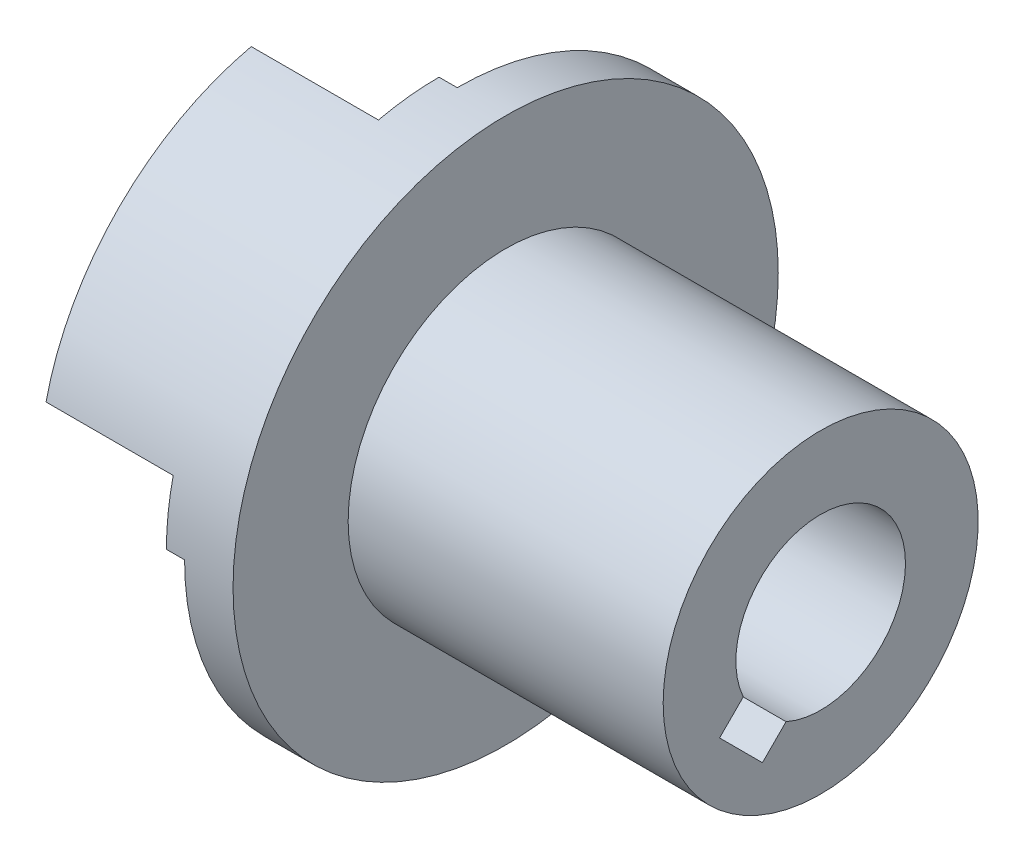
ISO-10303-21;
HEADER;
FILE_DESCRIPTION(('STEP AP214'),'2;1');
FILE_NAME('part.step','',(''),(''),'','','');
FILE_SCHEMA(('AUTOMOTIVE_DESIGN { 1 0 10303 214 1 1 1 1 }'));
ENDSEC;
DATA;
#1=APPLICATION_CONTEXT('core data for automotive mechanical design processes');
#2=APPLICATION_PROTOCOL_DEFINITION('international standard','automotive_design',2000,#1);
#3=PRODUCT_CONTEXT('',#1,'mechanical');
#4=PRODUCT('Part','Part','',(#3));
#5=PRODUCT_RELATED_PRODUCT_CATEGORY('part','',(#4));
#6=PRODUCT_DEFINITION_FORMATION('','',#4);
#7=PRODUCT_DEFINITION_CONTEXT('part definition',#1,'design');
#8=PRODUCT_DEFINITION('design','',#6,#7);
#9=PRODUCT_DEFINITION_SHAPE('','',#8);
#10=(LENGTH_UNIT() NAMED_UNIT(*) SI_UNIT(.MILLI.,.METRE.));
#11=(NAMED_UNIT(*) PLANE_ANGLE_UNIT() SI_UNIT($,.RADIAN.));
#12=(NAMED_UNIT(*) SI_UNIT($,.STERADIAN.) SOLID_ANGLE_UNIT());
#13=UNCERTAINTY_MEASURE_WITH_UNIT(LENGTH_MEASURE(1.E-05),#10,'distance_accuracy_value','');
#14=(GEOMETRIC_REPRESENTATION_CONTEXT(3) GLOBAL_UNCERTAINTY_ASSIGNED_CONTEXT((#13)) GLOBAL_UNIT_ASSIGNED_CONTEXT((#10,
#11,#12)) REPRESENTATION_CONTEXT('',''));
#15=CARTESIAN_POINT('',(0.,0.,0.));
#16=DIRECTION('',(0.,0.,1.));
#17=DIRECTION('',(1.,0.,0.));
#18=AXIS2_PLACEMENT_3D('',#15,#16,#17);
#19=CARTESIAN_POINT('',(-1.5,0.,0.));
#20=DIRECTION('',(-1.,0.,0.));
#21=DIRECTION('',(0.,0.,-1.));
#22=AXIS2_PLACEMENT_3D('',#19,#20,#21);
#23=PLANE('',#22);
#24=DIRECTION('',(0.,0.707106781186544,-0.707106781186552));
#25=VECTOR('',#24,1.);
#26=CARTESIAN_POINT('',(-1.5,-14.1421356237309,0.));
#27=LINE('',#26,#25);
#28=CARTESIAN_POINT('',(-1.5,-14.1421356237309,0.));
#29=VERTEX_POINT('',#28);
#30=CARTESIAN_POINT('',(-1.5,-9.14213562373095,-5.));
#31=VERTEX_POINT('',#30);
#32=EDGE_CURVE('E234',#29,#31,#27,.T.);
#33=ORIENTED_EDGE('',*,*,#32,.T.);
#34=DIRECTION('',(0.,1.,0.));
#35=VECTOR('',#34,1.);
#36=CARTESIAN_POINT('',(-1.5,-21.9374109684803,-5.));
#37=LINE('',#36,#35);
#38=CARTESIAN_POINT('',(-1.5,-21.9374109684803,-5.));
#39=VERTEX_POINT('',#38);
#40=EDGE_CURVE('E204',#39,#31,#37,.T.);
#41=ORIENTED_EDGE('',*,*,#40,.F.);
#42=CARTESIAN_POINT('',(-1.5,0.,0.));
#43=DIRECTION('',(-1.,0.,0.));
#44=DIRECTION('',(0.,0.,-1.));
#45=AXIS2_PLACEMENT_3D('',#42,#43,#44);
#46=CIRCLE('',#45,22.5);
#47=CARTESIAN_POINT('',(-1.5,-22.5,0.));
#48=VERTEX_POINT('',#47);
#49=EDGE_CURVE('E231',#39,#48,#46,.T.);
#50=ORIENTED_EDGE('',*,*,#49,.T.);
#51=DIRECTION('',(0.,1.,0.));
#52=VECTOR('',#51,1.);
#53=CARTESIAN_POINT('',(-1.5,-22.5,0.));
#54=LINE('',#53,#52);
#55=EDGE_CURVE('E230',#48,#29,#54,.T.);
#56=ORIENTED_EDGE('',*,*,#55,.T.);
#57=EDGE_LOOP('',(#33,#41,#50,#56));
#58=FACE_BOUND('',#57,.T.);
#59=ADVANCED_FACE('F35',(#58),#23,.T.);
#60=CARTESIAN_POINT('',(-1.5,0.,-22.5));
#61=VERTEX_POINT('',#60);
#62=CARTESIAN_POINT('',(-1.5,-5.,-21.9374109684803));
#63=VERTEX_POINT('',#62);
#64=EDGE_CURVE('E227',#61,#63,#46,.T.);
#65=ORIENTED_EDGE('',*,*,#64,.T.);
#66=DIRECTION('',(0.,0.,-1.));
#67=VECTOR('',#66,1.);
#68=CARTESIAN_POINT('',(-1.5,-5.,-9.14213562373095));
#69=LINE('',#68,#67);
#70=CARTESIAN_POINT('',(-1.5,-5.,-9.14213562373098));
#71=VERTEX_POINT('',#70);
#72=EDGE_CURVE('E209',#71,#63,#69,.T.);
#73=ORIENTED_EDGE('',*,*,#72,.F.);
#74=CARTESIAN_POINT('',(-1.5,0.,-14.142135623731));
#75=VERTEX_POINT('',#74);
#76=EDGE_CURVE('E233',#71,#75,#27,.T.);
#77=ORIENTED_EDGE('',*,*,#76,.T.);
#78=DIRECTION('',(0.,0.,-1.));
#79=VECTOR('',#78,1.);
#80=CARTESIAN_POINT('',(-1.5,0.,-22.5));
#81=LINE('',#80,#79);
#82=EDGE_CURVE('E237',#75,#61,#81,.T.);
#83=ORIENTED_EDGE('',*,*,#82,.T.);
#84=EDGE_LOOP('',(#65,#73,#77,#83));
#85=FACE_BOUND('',#84,.T.);
#86=ADVANCED_FACE('F391',(#85),#23,.T.);
#87=CARTESIAN_POINT('',(0.,22.5,0.));
#88=DIRECTION('',(1.,0.,0.));
#89=DIRECTION('',(0.,0.,-1.));
#90=AXIS2_PLACEMENT_3D('',#87,#88,#89);
#91=PLANE('',#90);
#92=DIRECTION('',(0.,-0.707106781186547,-0.707106781186548));
#93=VECTOR('',#92,1.);
#94=CARTESIAN_POINT('',(0.,4.67390693496511,17.8260930650349));
#95=LINE('',#94,#93);
#96=CARTESIAN_POINT('',(0.,-4.80832611206852,8.34386001800126));
#97=VERTEX_POINT('',#96);
#98=CARTESIAN_POINT('',(0.,-8.34386001800126,4.80832611206852));
#99=VERTEX_POINT('',#98);
#100=EDGE_CURVE('E180',#97,#99,#95,.T.);
#101=ORIENTED_EDGE('',*,*,#100,.T.);
#102=DIRECTION('',(0.,0.707106781186548,-0.707106781186547));
#103=VECTOR('',#102,1.);
#104=CARTESIAN_POINT('',(0.,9.48223304703364,-13.0177669529664));
#105=LINE('',#104,#103);
#106=CARTESIAN_POINT('',(0.,-6.3910774551931,2.85554354926036));
#107=VERTEX_POINT('',#106);
#108=EDGE_CURVE('E201',#99,#107,#105,.T.);
#109=ORIENTED_EDGE('',*,*,#108,.T.);
#110=CARTESIAN_POINT('',(0.,0.,0.));
#111=DIRECTION('',(-1.,0.,0.));
#112=DIRECTION('',(0.,0.,1.));
#113=AXIS2_PLACEMENT_3D('',#110,#111,#112);
#114=CIRCLE('',#113,7.);
#115=CARTESIAN_POINT('',(0.,-2.85554354926037,6.3910774551931));
#116=VERTEX_POINT('',#115);
#117=EDGE_CURVE('E328',#116,#107,#114,.T.);
#118=ORIENTED_EDGE('',*,*,#117,.F.);
#119=DIRECTION('',(0.,-0.707106781186547,0.707106781186548));
#120=VECTOR('',#119,1.);
#121=CARTESIAN_POINT('',(0.,13.0177669529664,-9.48223304703363));
#122=LINE('',#121,#120);
#123=EDGE_CURVE('E195',#116,#97,#122,.T.);
#124=ORIENTED_EDGE('',*,*,#123,.T.);
#125=EDGE_LOOP('',(#101,#109,#118,#124));
#126=FACE_BOUND('',#125,.T.);
#127=DIRECTION('',(0.,1.,0.));
#128=VECTOR('',#127,1.);
#129=CARTESIAN_POINT('',(0.,-22.5,0.));
#130=LINE('',#129,#128);
#131=CARTESIAN_POINT('',(0.,-22.5,0.));
#132=VERTEX_POINT('',#131);
#133=CARTESIAN_POINT('',(0.,-14.1421356237309,0.));
#134=VERTEX_POINT('',#133);
#135=EDGE_CURVE('E226',#132,#134,#130,.T.);
#136=ORIENTED_EDGE('',*,*,#135,.F.);
#137=CARTESIAN_POINT('',(0.,0.,0.));
#138=DIRECTION('',(-1.,0.,0.));
#139=DIRECTION('',(0.,0.,1.));
#140=AXIS2_PLACEMENT_3D('',#137,#138,#139);
#141=CIRCLE('',#140,22.5);
#142=CARTESIAN_POINT('',(0.,0.,22.5));
#143=VERTEX_POINT('',#142);
#144=EDGE_CURVE('E330',#132,#143,#141,.T.);
#145=ORIENTED_EDGE('',*,*,#144,.T.);
#146=DIRECTION('',(0.,0.,1.));
#147=VECTOR('',#146,1.);
#148=CARTESIAN_POINT('',(0.,0.,22.5));
#149=LINE('',#148,#147);
#150=CARTESIAN_POINT('',(0.,0.,14.142135623731));
#151=VERTEX_POINT('',#150);
#152=EDGE_CURVE('E303',#151,#143,#149,.T.);
#153=ORIENTED_EDGE('',*,*,#152,.F.);
#154=DIRECTION('',(0.,-0.707106781186544,0.707106781186552));
#155=VECTOR('',#154,1.);
#156=CARTESIAN_POINT('',(0.,14.1421356237309,0.));
#157=LINE('',#156,#155);
#158=CARTESIAN_POINT('',(0.,14.1421356237309,0.));
#159=VERTEX_POINT('',#158);
#160=EDGE_CURVE('E300',#159,#151,#157,.T.);
#161=ORIENTED_EDGE('',*,*,#160,.F.);
#162=DIRECTION('',(0.,-1.,0.));
#163=VECTOR('',#162,1.);
#164=CARTESIAN_POINT('',(0.,22.5,0.));
#165=LINE('',#164,#163);
#166=CARTESIAN_POINT('',(0.,22.5,0.));
#167=VERTEX_POINT('',#166);
#168=EDGE_CURVE('E286',#167,#159,#165,.T.);
#169=ORIENTED_EDGE('',*,*,#168,.F.);
#170=CARTESIAN_POINT('',(0.,0.,-22.5));
#171=VERTEX_POINT('',#170);
#172=EDGE_CURVE('E43',#167,#171,#141,.T.);
#173=ORIENTED_EDGE('',*,*,#172,.T.);
#174=DIRECTION('',(0.,0.,-1.));
#175=VECTOR('',#174,1.);
#176=CARTESIAN_POINT('',(0.,0.,-22.5));
#177=LINE('',#176,#175);
#178=CARTESIAN_POINT('',(0.,0.,-14.142135623731));
#179=VERTEX_POINT('',#178);
#180=EDGE_CURVE('E245',#179,#171,#177,.T.);
#181=ORIENTED_EDGE('',*,*,#180,.F.);
#182=DIRECTION('',(0.,0.707106781186544,-0.707106781186552));
#183=VECTOR('',#182,1.);
#184=CARTESIAN_POINT('',(0.,-14.1421356237309,0.));
#185=LINE('',#184,#183);
#186=EDGE_CURVE('E242',#134,#179,#185,.T.);
#187=ORIENTED_EDGE('',*,*,#186,.F.);
#188=EDGE_LOOP('',(#136,#145,#153,#161,#169,#173,#181,#187));
#189=FACE_BOUND('',#188,.T.);
#190=ADVANCED_FACE('F334',(#126,#189),#91,.F.);
#191=CARTESIAN_POINT('',(-1.5,0.,0.));
#192=DIRECTION('',(-1.,0.,0.));
#193=DIRECTION('',(0.,0.,1.));
#194=AXIS2_PLACEMENT_3D('',#191,#192,#193);
#195=PLANE('',#194);
#196=DIRECTION('',(0.,0.,1.));
#197=VECTOR('',#196,1.);
#198=CARTESIAN_POINT('',(-1.5,5.,9.14213562373095));
#199=LINE('',#198,#197);
#200=CARTESIAN_POINT('',(-1.5,5.,9.14213562373098));
#201=VERTEX_POINT('',#200);
#202=CARTESIAN_POINT('',(-1.5,5.,21.9374109684803));
#203=VERTEX_POINT('',#202);
#204=EDGE_CURVE('E264',#201,#203,#199,.T.);
#205=ORIENTED_EDGE('',*,*,#204,.F.);
#206=DIRECTION('',(0.,-0.707106781186544,0.707106781186552));
#207=VECTOR('',#206,1.);
#208=CARTESIAN_POINT('',(-1.5,14.1421356237309,0.));
#209=LINE('',#208,#207);
#210=CARTESIAN_POINT('',(-1.5,0.,14.142135623731));
#211=VERTEX_POINT('',#210);
#212=EDGE_CURVE('E292',#201,#211,#209,.T.);
#213=ORIENTED_EDGE('',*,*,#212,.T.);
#214=DIRECTION('',(0.,0.,1.));
#215=VECTOR('',#214,1.);
#216=CARTESIAN_POINT('',(-1.5,0.,22.5));
#217=LINE('',#216,#215);
#218=CARTESIAN_POINT('',(-1.5,0.,22.5));
#219=VERTEX_POINT('',#218);
#220=EDGE_CURVE('E295',#211,#219,#217,.T.);
#221=ORIENTED_EDGE('',*,*,#220,.T.);
#222=CARTESIAN_POINT('',(-1.5,0.,0.));
#223=DIRECTION('',(-1.,0.,0.));
#224=DIRECTION('',(0.,0.,1.));
#225=AXIS2_PLACEMENT_3D('',#222,#223,#224);
#226=CIRCLE('',#225,22.5);
#227=EDGE_CURVE('E287',#219,#203,#226,.T.);
#228=ORIENTED_EDGE('',*,*,#227,.T.);
#229=EDGE_LOOP('',(#205,#213,#221,#228));
#230=FACE_BOUND('',#229,.T.);
#231=ADVANCED_FACE('F347',(#230),#195,.T.);
#232=CARTESIAN_POINT('',(0.,0.,0.));
#233=DIRECTION('',(-1.,0.,0.));
#234=DIRECTION('',(0.,0.,1.));
#235=AXIS2_PLACEMENT_3D('',#232,#233,#234);
#236=CYLINDRICAL_SURFACE('',#235,22.5);
#237=ORIENTED_EDGE('',*,*,#172,.F.);
#238=DIRECTION('',(1.,0.,0.));
#239=VECTOR('',#238,1.);
#240=CARTESIAN_POINT('',(-1.5,22.5,0.));
#241=LINE('',#240,#239);
#242=CARTESIAN_POINT('',(-1.5,22.5,0.));
#243=VERTEX_POINT('',#242);
#244=EDGE_CURVE('E314',#243,#167,#241,.T.);
#245=ORIENTED_EDGE('',*,*,#244,.F.);
#246=CARTESIAN_POINT('',(-1.5,21.9374109684803,5.));
#247=VERTEX_POINT('',#246);
#248=EDGE_CURVE('E290',#247,#243,#226,.T.);
#249=ORIENTED_EDGE('',*,*,#248,.F.);
#250=DIRECTION('',(1.,0.,0.));
#251=VECTOR('',#250,1.);
#252=CARTESIAN_POINT('',(-12.,21.9374109684803,5.));
#253=LINE('',#252,#251);
#254=CARTESIAN_POINT('',(-12.,21.9374109684803,5.));
#255=VERTEX_POINT('',#254);
#256=EDGE_CURVE('E283',#255,#247,#253,.T.);
#257=ORIENTED_EDGE('',*,*,#256,.F.);
#258=CARTESIAN_POINT('',(-12.,0.,0.));
#259=DIRECTION('',(-1.,0.,0.));
#260=DIRECTION('',(0.,0.,1.));
#261=AXIS2_PLACEMENT_3D('',#258,#259,#260);
#262=CIRCLE('',#261,22.5);
#263=CARTESIAN_POINT('',(-12.,5.,21.9374109684803));
#264=VERTEX_POINT('',#263);
#265=EDGE_CURVE('E260',#264,#255,#262,.T.);
#266=ORIENTED_EDGE('',*,*,#265,.F.);
#267=DIRECTION('',(1.,0.,0.));
#268=VECTOR('',#267,1.);
#269=CARTESIAN_POINT('',(-12.,5.,21.9374109684803));
#270=LINE('',#269,#268);
#271=EDGE_CURVE('E270',#264,#203,#270,.T.);
#272=ORIENTED_EDGE('',*,*,#271,.T.);
#273=ORIENTED_EDGE('',*,*,#227,.F.);
#274=DIRECTION('',(1.,0.,0.));
#275=VECTOR('',#274,1.);
#276=CARTESIAN_POINT('',(-1.5,0.,22.5));
#277=LINE('',#276,#275);
#278=EDGE_CURVE('E297',#219,#143,#277,.T.);
#279=ORIENTED_EDGE('',*,*,#278,.T.);
#280=ORIENTED_EDGE('',*,*,#144,.F.);
#281=DIRECTION('',(1.,0.,0.));
#282=VECTOR('',#281,1.);
#283=CARTESIAN_POINT('',(-1.5,-22.5,0.));
#284=LINE('',#283,#282);
#285=EDGE_CURVE('E256',#48,#132,#284,.T.);
#286=ORIENTED_EDGE('',*,*,#285,.F.);
#287=ORIENTED_EDGE('',*,*,#49,.F.);
#288=DIRECTION('',(1.,0.,0.));
#289=VECTOR('',#288,1.);
#290=CARTESIAN_POINT('',(-12.,-21.9374109684803,-5.));
#291=LINE('',#290,#289);
#292=CARTESIAN_POINT('',(-12.,-21.9374109684803,-5.));
#293=VERTEX_POINT('',#292);
#294=EDGE_CURVE('E224',#293,#39,#291,.T.);
#295=ORIENTED_EDGE('',*,*,#294,.F.);
#296=CARTESIAN_POINT('',(-12.,0.,0.));
#297=DIRECTION('',(-1.,0.,0.));
#298=DIRECTION('',(0.,0.,-1.));
#299=AXIS2_PLACEMENT_3D('',#296,#297,#298);
#300=CIRCLE('',#299,22.5);
#301=CARTESIAN_POINT('',(-12.,-5.,-21.9374109684803));
#302=VERTEX_POINT('',#301);
#303=EDGE_CURVE('E205',#302,#293,#300,.T.);
#304=ORIENTED_EDGE('',*,*,#303,.F.);
#305=DIRECTION('',(1.,0.,0.));
#306=VECTOR('',#305,1.);
#307=CARTESIAN_POINT('',(-12.,-5.,-21.9374109684803));
#308=LINE('',#307,#306);
#309=EDGE_CURVE('E215',#302,#63,#308,.T.);
#310=ORIENTED_EDGE('',*,*,#309,.T.);
#311=ORIENTED_EDGE('',*,*,#64,.F.);
#312=DIRECTION('',(1.,0.,0.));
#313=VECTOR('',#312,1.);
#314=CARTESIAN_POINT('',(-1.5,0.,-22.5));
#315=LINE('',#314,#313);
#316=EDGE_CURVE('E239',#61,#171,#315,.T.);
#317=ORIENTED_EDGE('',*,*,#316,.T.);
#318=EDGE_LOOP('',(#237,#245,#249,#257,#266,#272,#273,#279,#280,#286,#287,#295,#304,#310,#311,#317));
#319=FACE_BOUND('',#318,.T.);
#320=CARTESIAN_POINT('',(4.,0.,0.));
#321=DIRECTION('',(-1.,0.,0.));
#322=DIRECTION('',(0.,0.,1.));
#323=AXIS2_PLACEMENT_3D('',#320,#321,#322);
#324=CIRCLE('',#323,22.5);
#325=CARTESIAN_POINT('',(4.,0.,22.5));
#326=VERTEX_POINT('',#325);
#327=EDGE_CURVE('E317',#326,#326,#324,.T.);
#328=ORIENTED_EDGE('',*,*,#327,.T.);
#329=EDGE_LOOP('',(#328));
#330=FACE_BOUND('',#329,.T.);
#331=ADVANCED_FACE('F37',(#319,#330),#236,.T.);
#332=CARTESIAN_POINT('',(0.,0.,0.));
#333=DIRECTION('',(-1.,0.,0.));
#334=DIRECTION('',(0.,0.,1.));
#335=AXIS2_PLACEMENT_3D('',#332,#333,#334);
#336=CYLINDRICAL_SURFACE('',#335,7.);
#337=ORIENTED_EDGE('',*,*,#117,.T.);
#338=DIRECTION('',(-1.,0.,0.));
#339=VECTOR('',#338,1.);
#340=CARTESIAN_POINT('',(0.,-6.3910774551931,2.85554354926036));
#341=LINE('',#340,#339);
#342=CARTESIAN_POINT('',(30.,-6.3910774551931,2.85554354926036));
#343=VERTEX_POINT('',#342);
#344=EDGE_CURVE('E198',#107,#343,#341,.F.);
#345=ORIENTED_EDGE('',*,*,#344,.T.);
#346=CARTESIAN_POINT('',(30.,0.,0.));
#347=DIRECTION('',(-1.,0.,0.));
#348=DIRECTION('',(0.,0.,1.));
#349=AXIS2_PLACEMENT_3D('',#346,#347,#348);
#350=CIRCLE('',#349,7.);
#351=CARTESIAN_POINT('',(30.,-2.85554354926036,6.3910774551931));
#352=VERTEX_POINT('',#351);
#353=EDGE_CURVE('E326',#352,#343,#350,.T.);
#354=ORIENTED_EDGE('',*,*,#353,.F.);
#355=DIRECTION('',(-1.,0.,0.));
#356=VECTOR('',#355,1.);
#357=CARTESIAN_POINT('',(0.,-2.85554354926037,6.3910774551931));
#358=LINE('',#357,#356);
#359=EDGE_CURVE('E50',#352,#116,#358,.T.);
#360=ORIENTED_EDGE('',*,*,#359,.T.);
#361=EDGE_LOOP('',(#337,#345,#354,#360));
#362=FACE_BOUND('',#361,.T.);
#363=ADVANCED_FACE('F444',(#362),#336,.F.);
#364=CARTESIAN_POINT('',(30.,7.,0.));
#365=DIRECTION('',(-1.,0.,0.));
#366=DIRECTION('',(0.,0.,1.));
#367=AXIS2_PLACEMENT_3D('',#364,#365,#366);
#368=PLANE('',#367);
#369=CARTESIAN_POINT('',(30.,0.,0.));
#370=DIRECTION('',(-1.,0.,0.));
#371=DIRECTION('',(0.,0.,1.));
#372=AXIS2_PLACEMENT_3D('',#369,#370,#371);
#373=CIRCLE('',#372,13.);
#374=CARTESIAN_POINT('',(30.,0.,13.));
#375=VERTEX_POINT('',#374);
#376=EDGE_CURVE('E323',#375,#375,#373,.T.);
#377=ORIENTED_EDGE('',*,*,#376,.F.);
#378=EDGE_LOOP('',(#377));
#379=FACE_BOUND('',#378,.T.);
#380=ORIENTED_EDGE('',*,*,#353,.T.);
#381=DIRECTION('',(0.,0.707106781186548,-0.707106781186547));
#382=VECTOR('',#381,1.);
#383=CARTESIAN_POINT('',(30.,-8.34386001800126,4.80832611206852));
#384=LINE('',#383,#382);
#385=CARTESIAN_POINT('',(30.,-8.34386001800126,4.80832611206852));
#386=VERTEX_POINT('',#385);
#387=EDGE_CURVE('E189',#386,#343,#384,.T.);
#388=ORIENTED_EDGE('',*,*,#387,.F.);
#389=DIRECTION('',(0.,-0.707106781186547,-0.707106781186548));
#390=VECTOR('',#389,1.);
#391=CARTESIAN_POINT('',(30.,-4.80832611206852,8.34386001800126));
#392=LINE('',#391,#390);
#393=CARTESIAN_POINT('',(30.,-4.80832611206852,8.34386001800126));
#394=VERTEX_POINT('',#393);
#395=EDGE_CURVE('E177',#394,#386,#392,.T.);
#396=ORIENTED_EDGE('',*,*,#395,.F.);
#397=DIRECTION('',(0.,0.707106781186547,-0.707106781186548));
#398=VECTOR('',#397,1.);
#399=CARTESIAN_POINT('',(30.,5.26776695296637,-1.73223304703363));
#400=LINE('',#399,#398);
#401=EDGE_CURVE('E11',#394,#352,#400,.T.);
#402=ORIENTED_EDGE('',*,*,#401,.T.);
#403=EDGE_LOOP('',(#380,#388,#396,#402));
#404=FACE_BOUND('',#403,.T.);
#405=ADVANCED_FACE('F188',(#379,#404),#368,.F.);
#406=CARTESIAN_POINT('',(0.,0.,0.));
#407=DIRECTION('',(-1.,0.,0.));
#408=DIRECTION('',(0.,0.,1.));
#409=AXIS2_PLACEMENT_3D('',#406,#407,#408);
#410=CYLINDRICAL_SURFACE('',#409,13.);
#411=CARTESIAN_POINT('',(4.,0.,0.));
#412=DIRECTION('',(-1.,0.,0.));
#413=DIRECTION('',(0.,0.,1.));
#414=AXIS2_PLACEMENT_3D('',#411,#412,#413);
#415=CIRCLE('',#414,13.);
#416=CARTESIAN_POINT('',(4.,0.,13.));
#417=VERTEX_POINT('',#416);
#418=EDGE_CURVE('E320',#417,#417,#415,.T.);
#419=ORIENTED_EDGE('',*,*,#418,.F.);
#420=EDGE_LOOP('',(#419));
#421=FACE_BOUND('',#420,.T.);
#422=ORIENTED_EDGE('',*,*,#376,.T.);
#423=EDGE_LOOP('',(#422));
#424=FACE_BOUND('',#423,.T.);
#425=ADVANCED_FACE('F437',(#421,#424),#410,.T.);
#426=CARTESIAN_POINT('',(4.,13.,0.));
#427=DIRECTION('',(-1.,0.,0.));
#428=DIRECTION('',(0.,0.,1.));
#429=AXIS2_PLACEMENT_3D('',#426,#427,#428);
#430=PLANE('',#429);
#431=ORIENTED_EDGE('',*,*,#327,.F.);
#432=EDGE_LOOP('',(#431));
#433=FACE_BOUND('',#432,.T.);
#434=ORIENTED_EDGE('',*,*,#418,.T.);
#435=EDGE_LOOP('',(#434));
#436=FACE_BOUND('',#435,.T.);
#437=ADVANCED_FACE('F434',(#433,#436),#430,.F.);
#438=CARTESIAN_POINT('',(-1.5,22.5,0.));
#439=DIRECTION('',(0.,0.,1.));
#440=DIRECTION('',(0.,-1.,0.));
#441=AXIS2_PLACEMENT_3D('',#438,#439,#440);
#442=PLANE('',#441);
#443=ORIENTED_EDGE('',*,*,#168,.T.);
#444=DIRECTION('',(1.,0.,0.));
#445=VECTOR('',#444,1.);
#446=CARTESIAN_POINT('',(-1.5,14.1421356237309,0.));
#447=LINE('',#446,#445);
#448=CARTESIAN_POINT('',(-1.5,14.1421356237309,0.));
#449=VERTEX_POINT('',#448);
#450=EDGE_CURVE('E311',#449,#159,#447,.T.);
#451=ORIENTED_EDGE('',*,*,#450,.F.);
#452=DIRECTION('',(0.,-1.,0.));
#453=VECTOR('',#452,1.);
#454=CARTESIAN_POINT('',(-1.5,22.5,0.));
#455=LINE('',#454,#453);
#456=EDGE_CURVE('E289',#243,#449,#455,.T.);
#457=ORIENTED_EDGE('',*,*,#456,.F.);
#458=ORIENTED_EDGE('',*,*,#244,.T.);
#459=EDGE_LOOP('',(#443,#451,#457,#458));
#460=FACE_BOUND('',#459,.T.);
#461=ADVANCED_FACE('F359',(#460),#442,.F.);
#462=CARTESIAN_POINT('',(-1.5,14.1421356237309,0.));
#463=DIRECTION('',(0.,0.707106781186551,0.707106781186544));
#464=DIRECTION('',(0.,-0.707106781186544,0.707106781186551));
#465=AXIS2_PLACEMENT_3D('',#462,#463,#464);
#466=PLANE('',#465);
#467=ORIENTED_EDGE('',*,*,#160,.T.);
#468=DIRECTION('',(1.,0.,0.));
#469=VECTOR('',#468,1.);
#470=CARTESIAN_POINT('',(-1.5,0.,14.142135623731));
#471=LINE('',#470,#469);
#472=EDGE_CURVE('E308',#211,#151,#471,.T.);
#473=ORIENTED_EDGE('',*,*,#472,.F.);
#474=ORIENTED_EDGE('',*,*,#212,.F.);
#475=DIRECTION('',(1.,0.,0.));
#476=VECTOR('',#475,1.);
#477=CARTESIAN_POINT('',(-12.,5.,9.14213562373095));
#478=LINE('',#477,#476);
#479=CARTESIAN_POINT('',(-12.,5.,9.14213562373095));
#480=VERTEX_POINT('',#479);
#481=EDGE_CURVE('E277',#480,#201,#478,.T.);
#482=ORIENTED_EDGE('',*,*,#481,.F.);
#483=DIRECTION('',(0.,-0.707106781186548,0.707106781186548));
#484=VECTOR('',#483,1.);
#485=CARTESIAN_POINT('',(-12.,9.14213562373095,5.));
#486=LINE('',#485,#484);
#487=CARTESIAN_POINT('',(-12.,9.14213562373095,5.));
#488=VERTEX_POINT('',#487);
#489=EDGE_CURVE('E266',#488,#480,#486,.T.);
#490=ORIENTED_EDGE('',*,*,#489,.F.);
#491=DIRECTION('',(1.,0.,0.));
#492=VECTOR('',#491,1.);
#493=CARTESIAN_POINT('',(-12.,9.14213562373095,5.));
#494=LINE('',#493,#492);
#495=CARTESIAN_POINT('',(-1.5,9.14213562373095,5.));
#496=VERTEX_POINT('',#495);
#497=EDGE_CURVE('E280',#488,#496,#494,.T.);
#498=ORIENTED_EDGE('',*,*,#497,.T.);
#499=EDGE_CURVE('E293',#449,#496,#209,.T.);
#500=ORIENTED_EDGE('',*,*,#499,.F.);
#501=ORIENTED_EDGE('',*,*,#450,.T.);
#502=EDGE_LOOP('',(#467,#473,#474,#482,#490,#498,#500,#501));
#503=FACE_BOUND('',#502,.T.);
#504=ADVANCED_FACE('F355',(#503),#466,.F.);
#505=CARTESIAN_POINT('',(-1.5,0.,22.5));
#506=DIRECTION('',(0.,1.,0.));
#507=DIRECTION('',(0.,0.,1.));
#508=AXIS2_PLACEMENT_3D('',#505,#506,#507);
#509=PLANE('',#508);
#510=ORIENTED_EDGE('',*,*,#152,.T.);
#511=ORIENTED_EDGE('',*,*,#278,.F.);
#512=ORIENTED_EDGE('',*,*,#220,.F.);
#513=ORIENTED_EDGE('',*,*,#472,.T.);
#514=EDGE_LOOP('',(#510,#511,#512,#513));
#515=FACE_BOUND('',#514,.T.);
#516=ADVANCED_FACE('F339',(#515),#509,.F.);
#517=DIRECTION('',(0.,-1.,0.));
#518=VECTOR('',#517,1.);
#519=CARTESIAN_POINT('',(-1.5,21.9374109684803,5.));
#520=LINE('',#519,#518);
#521=EDGE_CURVE('E259',#247,#496,#520,.T.);
#522=ORIENTED_EDGE('',*,*,#521,.F.);
#523=ORIENTED_EDGE('',*,*,#248,.T.);
#524=ORIENTED_EDGE('',*,*,#456,.T.);
#525=ORIENTED_EDGE('',*,*,#499,.T.);
#526=EDGE_LOOP('',(#522,#523,#524,#525));
#527=FACE_BOUND('',#526,.T.);
#528=ADVANCED_FACE('F423',(#527),#195,.T.);
#529=CARTESIAN_POINT('',(-12.,21.9374109684803,5.));
#530=DIRECTION('',(0.,0.,1.));
#531=DIRECTION('',(0.,-1.,0.));
#532=AXIS2_PLACEMENT_3D('',#529,#530,#531);
#533=PLANE('',#532);
#534=ORIENTED_EDGE('',*,*,#521,.T.);
#535=ORIENTED_EDGE('',*,*,#497,.F.);
#536=DIRECTION('',(0.,-1.,0.));
#537=VECTOR('',#536,1.);
#538=CARTESIAN_POINT('',(-12.,21.9374109684803,5.));
#539=LINE('',#538,#537);
#540=EDGE_CURVE('E263',#255,#488,#539,.T.);
#541=ORIENTED_EDGE('',*,*,#540,.F.);
#542=ORIENTED_EDGE('',*,*,#256,.T.);
#543=EDGE_LOOP('',(#534,#535,#541,#542));
#544=FACE_BOUND('',#543,.T.);
#545=ADVANCED_FACE('F420',(#544),#533,.F.);
#546=CARTESIAN_POINT('',(-12.,5.,9.14213562373095));
#547=DIRECTION('',(0.,1.,0.));
#548=DIRECTION('',(0.,0.,1.));
#549=AXIS2_PLACEMENT_3D('',#546,#547,#548);
#550=PLANE('',#549);
#551=ORIENTED_EDGE('',*,*,#204,.T.);
#552=ORIENTED_EDGE('',*,*,#271,.F.);
#553=DIRECTION('',(0.,0.,1.));
#554=VECTOR('',#553,1.);
#555=CARTESIAN_POINT('',(-12.,5.,9.14213562373095));
#556=LINE('',#555,#554);
#557=EDGE_CURVE('E268',#480,#264,#556,.T.);
#558=ORIENTED_EDGE('',*,*,#557,.F.);
#559=ORIENTED_EDGE('',*,*,#481,.T.);
#560=EDGE_LOOP('',(#551,#552,#558,#559));
#561=FACE_BOUND('',#560,.T.);
#562=ADVANCED_FACE('F350',(#561),#550,.F.);
#563=CARTESIAN_POINT('',(-12.,0.,0.));
#564=DIRECTION('',(-1.,0.,0.));
#565=DIRECTION('',(0.,0.,1.));
#566=AXIS2_PLACEMENT_3D('',#563,#564,#565);
#567=PLANE('',#566);
#568=ORIENTED_EDGE('',*,*,#265,.T.);
#569=ORIENTED_EDGE('',*,*,#540,.T.);
#570=ORIENTED_EDGE('',*,*,#489,.T.);
#571=ORIENTED_EDGE('',*,*,#557,.T.);
#572=EDGE_LOOP('',(#568,#569,#570,#571));
#573=FACE_BOUND('',#572,.T.);
#574=ADVANCED_FACE('F414',(#573),#567,.T.);
#575=CARTESIAN_POINT('',(-1.5,-22.5,0.));
#576=DIRECTION('',(0.,0.,-1.));
#577=DIRECTION('',(0.,1.,0.));
#578=AXIS2_PLACEMENT_3D('',#575,#576,#577);
#579=PLANE('',#578);
#580=ORIENTED_EDGE('',*,*,#135,.T.);
#581=DIRECTION('',(1.,0.,0.));
#582=VECTOR('',#581,1.);
#583=CARTESIAN_POINT('',(-1.5,-14.1421356237309,0.));
#584=LINE('',#583,#582);
#585=EDGE_CURVE('E253',#29,#134,#584,.T.);
#586=ORIENTED_EDGE('',*,*,#585,.F.);
#587=ORIENTED_EDGE('',*,*,#55,.F.);
#588=ORIENTED_EDGE('',*,*,#285,.T.);
#589=EDGE_LOOP('',(#580,#586,#587,#588));
#590=FACE_BOUND('',#589,.T.);
#591=ADVANCED_FACE('F377',(#590),#579,.F.);
#592=CARTESIAN_POINT('',(-1.5,-14.1421356237309,0.));
#593=DIRECTION('',(0.,-0.707106781186551,-0.707106781186544));
#594=DIRECTION('',(0.,0.707106781186544,-0.707106781186551));
#595=AXIS2_PLACEMENT_3D('',#592,#593,#594);
#596=PLANE('',#595);
#597=ORIENTED_EDGE('',*,*,#186,.T.);
#598=DIRECTION('',(1.,0.,0.));
#599=VECTOR('',#598,1.);
#600=CARTESIAN_POINT('',(-1.5,0.,-14.142135623731));
#601=LINE('',#600,#599);
#602=EDGE_CURVE('E250',#75,#179,#601,.T.);
#603=ORIENTED_EDGE('',*,*,#602,.F.);
#604=ORIENTED_EDGE('',*,*,#76,.F.);
#605=DIRECTION('',(1.,0.,0.));
#606=VECTOR('',#605,1.);
#607=CARTESIAN_POINT('',(-12.,-5.,-9.14213562373095));
#608=LINE('',#607,#606);
#609=CARTESIAN_POINT('',(-12.,-5.,-9.14213562373095));
#610=VERTEX_POINT('',#609);
#611=EDGE_CURVE('E57',#610,#71,#608,.T.);
#612=ORIENTED_EDGE('',*,*,#611,.F.);
#613=DIRECTION('',(0.,0.707106781186548,-0.707106781186548));
#614=VECTOR('',#613,1.);
#615=CARTESIAN_POINT('',(-12.,-9.14213562373095,-5.));
#616=LINE('',#615,#614);
#617=CARTESIAN_POINT('',(-12.,-9.14213562373095,-5.));
#618=VERTEX_POINT('',#617);
#619=EDGE_CURVE('E211',#618,#610,#616,.T.);
#620=ORIENTED_EDGE('',*,*,#619,.F.);
#621=DIRECTION('',(1.,0.,0.));
#622=VECTOR('',#621,1.);
#623=CARTESIAN_POINT('',(-12.,-9.14213562373095,-5.));
#624=LINE('',#623,#622);
#625=EDGE_CURVE('E221',#618,#31,#624,.T.);
#626=ORIENTED_EDGE('',*,*,#625,.T.);
#627=ORIENTED_EDGE('',*,*,#32,.F.);
#628=ORIENTED_EDGE('',*,*,#585,.T.);
#629=EDGE_LOOP('',(#597,#603,#604,#612,#620,#626,#627,#628));
#630=FACE_BOUND('',#629,.T.);
#631=ADVANCED_FACE('F371',(#630),#596,.F.);
#632=CARTESIAN_POINT('',(-1.5,0.,-22.5));
#633=DIRECTION('',(0.,-1.,0.));
#634=DIRECTION('',(0.,0.,-1.));
#635=AXIS2_PLACEMENT_3D('',#632,#633,#634);
#636=PLANE('',#635);
#637=ORIENTED_EDGE('',*,*,#180,.T.);
#638=ORIENTED_EDGE('',*,*,#316,.F.);
#639=ORIENTED_EDGE('',*,*,#82,.F.);
#640=ORIENTED_EDGE('',*,*,#602,.T.);
#641=EDGE_LOOP('',(#637,#638,#639,#640));
#642=FACE_BOUND('',#641,.T.);
#643=ADVANCED_FACE('F368',(#642),#636,.F.);
#644=CARTESIAN_POINT('',(-12.,-21.9374109684803,-5.));
#645=DIRECTION('',(0.,0.,-1.));
#646=DIRECTION('',(0.,1.,0.));
#647=AXIS2_PLACEMENT_3D('',#644,#645,#646);
#648=PLANE('',#647);
#649=ORIENTED_EDGE('',*,*,#40,.T.);
#650=ORIENTED_EDGE('',*,*,#625,.F.);
#651=DIRECTION('',(0.,1.,0.));
#652=VECTOR('',#651,1.);
#653=CARTESIAN_POINT('',(-12.,-21.9374109684803,-5.));
#654=LINE('',#653,#652);
#655=EDGE_CURVE('E208',#293,#618,#654,.T.);
#656=ORIENTED_EDGE('',*,*,#655,.F.);
#657=ORIENTED_EDGE('',*,*,#294,.T.);
#658=EDGE_LOOP('',(#649,#650,#656,#657));
#659=FACE_BOUND('',#658,.T.);
#660=ADVANCED_FACE('F385',(#659),#648,.F.);
#661=CARTESIAN_POINT('',(-12.,-5.,-9.14213562373095));
#662=DIRECTION('',(0.,-1.,0.));
#663=DIRECTION('',(0.,0.,-1.));
#664=AXIS2_PLACEMENT_3D('',#661,#662,#663);
#665=PLANE('',#664);
#666=ORIENTED_EDGE('',*,*,#72,.T.);
#667=ORIENTED_EDGE('',*,*,#309,.F.);
#668=DIRECTION('',(0.,0.,-1.));
#669=VECTOR('',#668,1.);
#670=CARTESIAN_POINT('',(-12.,-5.,-9.14213562373095));
#671=LINE('',#670,#669);
#672=EDGE_CURVE('E213',#610,#302,#671,.T.);
#673=ORIENTED_EDGE('',*,*,#672,.F.);
#674=ORIENTED_EDGE('',*,*,#611,.T.);
#675=EDGE_LOOP('',(#666,#667,#673,#674));
#676=FACE_BOUND('',#675,.T.);
#677=ADVANCED_FACE('F392',(#676),#665,.F.);
#678=CARTESIAN_POINT('',(-12.,0.,0.));
#679=DIRECTION('',(-1.,0.,0.));
#680=DIRECTION('',(0.,0.,-1.));
#681=AXIS2_PLACEMENT_3D('',#678,#679,#680);
#682=PLANE('',#681);
#683=ORIENTED_EDGE('',*,*,#303,.T.);
#684=ORIENTED_EDGE('',*,*,#655,.T.);
#685=ORIENTED_EDGE('',*,*,#619,.T.);
#686=ORIENTED_EDGE('',*,*,#672,.T.);
#687=EDGE_LOOP('',(#683,#684,#685,#686));
#688=FACE_BOUND('',#687,.T.);
#689=ADVANCED_FACE('F388',(#688),#682,.T.);
#690=CARTESIAN_POINT('',(-12.,-8.34386001800126,4.80832611206852));
#691=DIRECTION('',(0.,-0.707106781186547,-0.707106781186548));
#692=DIRECTION('',(0.,0.707106781186548,-0.707106781186547));
#693=AXIS2_PLACEMENT_3D('',#690,#691,#692);
#694=PLANE('',#693);
#695=DIRECTION('',(1.,0.,0.));
#696=VECTOR('',#695,1.);
#697=CARTESIAN_POINT('',(-12.,-8.34386001800126,4.80832611206852));
#698=LINE('',#697,#696);
#699=EDGE_CURVE('E182',#99,#386,#698,.T.);
#700=ORIENTED_EDGE('',*,*,#699,.T.);
#701=ORIENTED_EDGE('',*,*,#387,.T.);
#702=ORIENTED_EDGE('',*,*,#344,.F.);
#703=ORIENTED_EDGE('',*,*,#108,.F.);
#704=EDGE_LOOP('',(#700,#701,#702,#703));
#705=FACE_BOUND('',#704,.T.);
#706=ADVANCED_FACE('F399',(#705),#694,.F.);
#707=CARTESIAN_POINT('',(-12.,-4.80832611206852,8.34386001800126));
#708=DIRECTION('',(0.,-0.707106781186548,0.707106781186547));
#709=DIRECTION('',(0.,-0.707106781186547,-0.707106781186548));
#710=AXIS2_PLACEMENT_3D('',#707,#708,#709);
#711=PLANE('',#710);
#712=DIRECTION('',(1.,0.,0.));
#713=VECTOR('',#712,1.);
#714=CARTESIAN_POINT('',(-12.,-4.80832611206852,8.34386001800126));
#715=LINE('',#714,#713);
#716=EDGE_CURVE('E173',#97,#394,#715,.T.);
#717=ORIENTED_EDGE('',*,*,#716,.T.);
#718=ORIENTED_EDGE('',*,*,#395,.T.);
#719=ORIENTED_EDGE('',*,*,#699,.F.);
#720=ORIENTED_EDGE('',*,*,#100,.F.);
#721=EDGE_LOOP('',(#717,#718,#719,#720));
#722=FACE_BOUND('',#721,.T.);
#723=ADVANCED_FACE('F174',(#722),#711,.F.);
#724=CARTESIAN_POINT('',(-12.,1.76776695296637,1.76776695296636));
#725=DIRECTION('',(0.,0.707106781186547,0.707106781186547));
#726=DIRECTION('',(0.,-0.707106781186547,0.707106781186548));
#727=AXIS2_PLACEMENT_3D('',#724,#725,#726);
#728=PLANE('',#727);
#729=ORIENTED_EDGE('',*,*,#359,.F.);
#730=ORIENTED_EDGE('',*,*,#401,.F.);
#731=ORIENTED_EDGE('',*,*,#716,.F.);
#732=ORIENTED_EDGE('',*,*,#123,.F.);
#733=EDGE_LOOP('',(#729,#730,#731,#732));
#734=FACE_BOUND('',#733,.T.);
#735=ADVANCED_FACE('F184',(#734),#728,.F.);
#736=CLOSED_SHELL('',(#59,#86,#190,#231,#331,#363,#405,#425,#437,#461,#504,#516,#528,#545,#562,
#574,#591,#631,#643,#660,#677,#689,#706,#723,#735));
#737=MANIFOLD_SOLID_BREP('B2',#736);
#738=ADVANCED_BREP_SHAPE_REPRESENTATION('',(#18,#737),#14);
#739=SHAPE_DEFINITION_REPRESENTATION(#9,#738);
ENDSEC;
END-ISO-10303-21;
